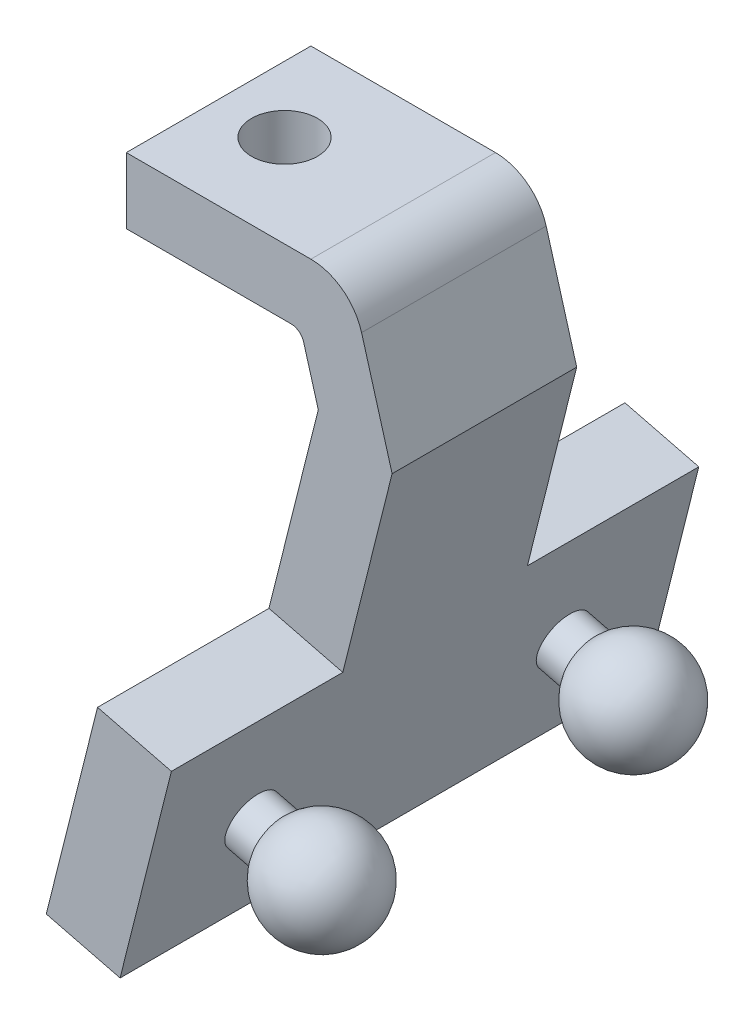
ISO-10303-21;
HEADER;
FILE_DESCRIPTION(('STEP AP214'),'2;1');
FILE_NAME('part.step','',(''),(''),'','','');
FILE_SCHEMA(('AUTOMOTIVE_DESIGN { 1 0 10303 214 1 1 1 1 }'));
ENDSEC;
DATA;
#1=APPLICATION_CONTEXT('core data for automotive mechanical design processes');
#2=APPLICATION_PROTOCOL_DEFINITION('international standard','automotive_design',2000,#1);
#3=PRODUCT_CONTEXT('',#1,'mechanical');
#4=PRODUCT('Part','Part','',(#3));
#5=PRODUCT_RELATED_PRODUCT_CATEGORY('part','',(#4));
#6=PRODUCT_DEFINITION_FORMATION('','',#4);
#7=PRODUCT_DEFINITION_CONTEXT('part definition',#1,'design');
#8=PRODUCT_DEFINITION('design','',#6,#7);
#9=PRODUCT_DEFINITION_SHAPE('','',#8);
#10=(LENGTH_UNIT() NAMED_UNIT(*) SI_UNIT(.MILLI.,.METRE.));
#11=(NAMED_UNIT(*) PLANE_ANGLE_UNIT() SI_UNIT($,.RADIAN.));
#12=(NAMED_UNIT(*) SI_UNIT($,.STERADIAN.) SOLID_ANGLE_UNIT());
#13=UNCERTAINTY_MEASURE_WITH_UNIT(LENGTH_MEASURE(1.E-05),#10,'distance_accuracy_value','');
#14=(GEOMETRIC_REPRESENTATION_CONTEXT(3) GLOBAL_UNCERTAINTY_ASSIGNED_CONTEXT((#13)) GLOBAL_UNIT_ASSIGNED_CONTEXT((#10,
#11,#12)) REPRESENTATION_CONTEXT('',''));
#15=CARTESIAN_POINT('',(0.,0.,0.));
#16=DIRECTION('',(0.,0.,1.));
#17=DIRECTION('',(1.,0.,0.));
#18=AXIS2_PLACEMENT_3D('',#15,#16,#17);
#19=CARTESIAN_POINT('',(0.,0.,3.5));
#20=DIRECTION('',(1.,0.,0.));
#21=DIRECTION('',(0.,0.,-1.));
#22=AXIS2_PLACEMENT_3D('',#19,#20,#21);
#23=PLANE('',#22);
#24=DIRECTION('',(0.,-1.,0.));
#25=VECTOR('',#24,1.);
#26=CARTESIAN_POINT('',(0.,0.,-3.5));
#27=LINE('',#26,#25);
#28=CARTESIAN_POINT('',(0.,2.5,-3.5));
#29=VERTEX_POINT('',#28);
#30=CARTESIAN_POINT('',(0.,0.,-3.5));
#31=VERTEX_POINT('',#30);
#32=EDGE_CURVE('E212',#29,#31,#27,.T.);
#33=ORIENTED_EDGE('',*,*,#32,.T.);
#34=DIRECTION('',(0.,0.,-1.));
#35=VECTOR('',#34,1.);
#36=CARTESIAN_POINT('',(0.,0.,3.5));
#37=LINE('',#36,#35);
#38=CARTESIAN_POINT('',(0.,0.,3.5));
#39=VERTEX_POINT('',#38);
#40=EDGE_CURVE('E252',#39,#31,#37,.T.);
#41=ORIENTED_EDGE('',*,*,#40,.F.);
#42=DIRECTION('',(0.,-1.,0.));
#43=VECTOR('',#42,1.);
#44=CARTESIAN_POINT('',(0.,0.,3.5));
#45=LINE('',#44,#43);
#46=CARTESIAN_POINT('',(0.,2.5,3.5));
#47=VERTEX_POINT('',#46);
#48=EDGE_CURVE('E192',#47,#39,#45,.T.);
#49=ORIENTED_EDGE('',*,*,#48,.F.);
#50=DIRECTION('',(0.,0.,-1.));
#51=VECTOR('',#50,1.);
#52=CARTESIAN_POINT('',(0.,2.5,3.5));
#53=LINE('',#52,#51);
#54=EDGE_CURVE('E211',#47,#29,#53,.T.);
#55=ORIENTED_EDGE('',*,*,#54,.T.);
#56=EDGE_LOOP('',(#33,#41,#49,#55));
#57=FACE_BOUND('',#56,.T.);
#58=ADVANCED_FACE('F41',(#57),#23,.F.);
#59=CARTESIAN_POINT('',(0.,0.,3.5));
#60=DIRECTION('',(0.,1.,0.));
#61=DIRECTION('',(0.,0.,1.));
#62=AXIS2_PLACEMENT_3D('',#59,#60,#61);
#63=PLANE('',#62);
#64=CARTESIAN_POINT('',(2.5,0.,0.));
#65=DIRECTION('',(0.,-1.,0.));
#66=DIRECTION('',(1.,0.,0.));
#67=AXIS2_PLACEMENT_3D('',#64,#65,#66);
#68=CIRCLE('',#67,1.25);
#69=CARTESIAN_POINT('',(3.75,0.,0.));
#70=VERTEX_POINT('',#69);
#71=EDGE_CURVE('E188',#70,#70,#68,.T.);
#72=ORIENTED_EDGE('',*,*,#71,.F.);
#73=EDGE_LOOP('',(#72));
#74=FACE_BOUND('',#73,.T.);
#75=DIRECTION('',(1.,0.,0.));
#76=VECTOR('',#75,1.);
#77=CARTESIAN_POINT('',(0.,0.,-3.5));
#78=LINE('',#77,#76);
#79=CARTESIAN_POINT('',(6.24543275290352,0.,-3.5));
#80=VERTEX_POINT('',#79);
#81=EDGE_CURVE('E215',#31,#80,#78,.T.);
#82=ORIENTED_EDGE('',*,*,#81,.T.);
#83=DIRECTION('',(0.,0.,-1.));
#84=VECTOR('',#83,1.);
#85=CARTESIAN_POINT('',(6.24543275290352,0.,3.5));
#86=LINE('',#85,#84);
#87=CARTESIAN_POINT('',(6.24543275290352,0.,3.5));
#88=VERTEX_POINT('',#87);
#89=EDGE_CURVE('E249',#88,#80,#86,.T.);
#90=ORIENTED_EDGE('',*,*,#89,.F.);
#91=DIRECTION('',(1.,0.,0.));
#92=VECTOR('',#91,1.);
#93=CARTESIAN_POINT('',(0.,0.,3.5));
#94=LINE('',#93,#92);
#95=EDGE_CURVE('E195',#39,#88,#94,.T.);
#96=ORIENTED_EDGE('',*,*,#95,.F.);
#97=ORIENTED_EDGE('',*,*,#40,.T.);
#98=EDGE_LOOP('',(#82,#90,#96,#97));
#99=FACE_BOUND('',#98,.T.);
#100=ADVANCED_FACE('F295',(#74,#99),#63,.F.);
#101=CARTESIAN_POINT('',(6.24543275290367,-0.5,3.5));
#102=DIRECTION('',(0.,0.,-1.));
#103=DIRECTION('',(-1.,0.,0.));
#104=AXIS2_PLACEMENT_3D('',#101,#102,#103);
#105=CYLINDRICAL_SURFACE('',#104,0.499999999999929);
#106=CARTESIAN_POINT('',(6.24543275290367,-0.5,-3.5));
#107=DIRECTION('',(0.,0.,-1.));
#108=DIRECTION('',(-1.,0.,0.));
#109=AXIS2_PLACEMENT_3D('',#106,#107,#108);
#110=CIRCLE('',#109,0.499999999999929);
#111=CARTESIAN_POINT('',(6.72624123981867,-0.362802336352114,-3.5));
#112=VERTEX_POINT('',#111);
#113=EDGE_CURVE('E217',#80,#112,#110,.T.);
#114=ORIENTED_EDGE('',*,*,#113,.T.);
#115=DIRECTION('',(0.,0.,-1.));
#116=VECTOR('',#115,1.);
#117=CARTESIAN_POINT('',(6.72624123981867,-0.362802336352114,3.5));
#118=LINE('',#117,#116);
#119=CARTESIAN_POINT('',(6.72624123981867,-0.362802336352114,3.5));
#120=VERTEX_POINT('',#119);
#121=EDGE_CURVE('E246',#120,#112,#118,.T.);
#122=ORIENTED_EDGE('',*,*,#121,.F.);
#123=CARTESIAN_POINT('',(6.24543275290367,-0.5,3.5));
#124=DIRECTION('',(0.,0.,-1.));
#125=DIRECTION('',(-1.,0.,0.));
#126=AXIS2_PLACEMENT_3D('',#123,#124,#125);
#127=CIRCLE('',#126,0.499999999999929);
#128=EDGE_CURVE('E198',#88,#120,#127,.T.);
#129=ORIENTED_EDGE('',*,*,#128,.F.);
#130=ORIENTED_EDGE('',*,*,#89,.T.);
#131=EDGE_LOOP('',(#114,#122,#129,#130));
#132=FACE_BOUND('',#131,.T.);
#133=ADVANCED_FACE('F291',(#132),#105,.F.);
#134=CARTESIAN_POINT('',(6.7262412398186,-0.362802336352133,3.5));
#135=DIRECTION('',(0.961616973830157,0.274395327295732,0.));
#136=DIRECTION('',(-0.274395327295732,0.961616973830157,0.));
#137=AXIS2_PLACEMENT_3D('',#134,#135,#136);
#138=PLANE('',#137);
#139=DIRECTION('',(0.274395327295732,-0.961616973830156,0.));
#140=VECTOR('',#139,1.);
#141=CARTESIAN_POINT('',(6.7262412398186,-0.362802336352133,-3.5));
#142=LINE('',#141,#140);
#143=CARTESIAN_POINT('',(7.28017081267278,-2.30404559589561,-3.5));
#144=VERTEX_POINT('',#143);
#145=EDGE_CURVE('E219',#112,#144,#142,.T.);
#146=ORIENTED_EDGE('',*,*,#145,.T.);
#147=DIRECTION('',(0.,0.,-1.));
#148=VECTOR('',#147,1.);
#149=CARTESIAN_POINT('',(7.28017081267278,-2.30404559589561,3.5));
#150=LINE('',#149,#148);
#151=CARTESIAN_POINT('',(7.28017081267278,-2.30404559589561,3.5));
#152=VERTEX_POINT('',#151);
#153=EDGE_CURVE('E244',#152,#144,#150,.T.);
#154=ORIENTED_EDGE('',*,*,#153,.F.);
#155=DIRECTION('',(0.274395327295732,-0.961616973830156,0.));
#156=VECTOR('',#155,1.);
#157=CARTESIAN_POINT('',(6.7262412398186,-0.362802336352133,3.5));
#158=LINE('',#157,#156);
#159=EDGE_CURVE('E200',#120,#152,#158,.T.);
#160=ORIENTED_EDGE('',*,*,#159,.F.);
#161=ORIENTED_EDGE('',*,*,#121,.T.);
#162=EDGE_LOOP('',(#146,#154,#160,#161));
#163=FACE_BOUND('',#162,.T.);
#164=ADVANCED_FACE('F286',(#163),#138,.F.);
#165=CARTESIAN_POINT('',(7.28017081267278,-2.30404559589561,3.5));
#166=DIRECTION('',(0.969982391695104,-0.243175162797203,0.));
#167=DIRECTION('',(0.243175162797203,0.969982391695104,0.));
#168=AXIS2_PLACEMENT_3D('',#165,#166,#167);
#169=PLANE('',#168);
#170=DIRECTION('',(-0.243175162797203,-0.969982391695104,0.));
#171=VECTOR('',#170,1.);
#172=CARTESIAN_POINT('',(7.28017081267278,-2.30404559589561,-3.5));
#173=LINE('',#172,#171);
#174=CARTESIAN_POINT('',(5.41022451132622,-9.76292817607996,-3.5));
#175=VERTEX_POINT('',#174);
#176=EDGE_CURVE('E159',#144,#175,#173,.T.);
#177=ORIENTED_EDGE('',*,*,#176,.T.);
#178=DIRECTION('',(0.,0.,1.));
#179=VECTOR('',#178,1.);
#180=CARTESIAN_POINT('',(5.41022451132622,-9.76292817607996,10.));
#181=LINE('',#180,#179);
#182=CARTESIAN_POINT('',(5.41022451132622,-9.76292817607996,-10.));
#183=VERTEX_POINT('',#182);
#184=EDGE_CURVE('E144',#183,#175,#181,.T.);
#185=ORIENTED_EDGE('',*,*,#184,.F.);
#186=DIRECTION('',(0.243175162797199,0.969982391695105,0.));
#187=VECTOR('',#186,1.);
#188=CARTESIAN_POINT('',(5.41022451132622,-9.76292817607996,-10.));
#189=LINE('',#188,#187);
#190=CARTESIAN_POINT('',(3.46482320894863,-17.5227873096408,-10.));
#191=VERTEX_POINT('',#190);
#192=EDGE_CURVE('E156',#191,#183,#189,.T.);
#193=ORIENTED_EDGE('',*,*,#192,.F.);
#194=DIRECTION('',(0.,0.,-1.));
#195=VECTOR('',#194,1.);
#196=CARTESIAN_POINT('',(3.4648232089486,-17.5227873096408,3.5));
#197=LINE('',#196,#195);
#198=CARTESIAN_POINT('',(3.46482320894863,-17.5227873096408,10.));
#199=VERTEX_POINT('',#198);
#200=EDGE_CURVE('E242',#199,#191,#197,.T.);
#201=ORIENTED_EDGE('',*,*,#200,.F.);
#202=DIRECTION('',(-0.243175162797199,-0.969982391695105,0.));
#203=VECTOR('',#202,1.);
#204=CARTESIAN_POINT('',(5.41022451132622,-9.76292817607996,10.));
#205=LINE('',#204,#203);
#206=CARTESIAN_POINT('',(5.41022451132622,-9.76292817607996,10.));
#207=VERTEX_POINT('',#206);
#208=EDGE_CURVE('E150',#207,#199,#205,.T.);
#209=ORIENTED_EDGE('',*,*,#208,.F.);
#210=CARTESIAN_POINT('',(5.41022451132622,-9.76292817607996,3.5));
#211=VERTEX_POINT('',#210);
#212=EDGE_CURVE('E160',#211,#207,#181,.T.);
#213=ORIENTED_EDGE('',*,*,#212,.F.);
#214=DIRECTION('',(-0.243175162797203,-0.969982391695104,0.));
#215=VECTOR('',#214,1.);
#216=CARTESIAN_POINT('',(7.28017081267278,-2.30404559589561,3.5));
#217=LINE('',#216,#215);
#218=EDGE_CURVE('E55',#152,#211,#217,.T.);
#219=ORIENTED_EDGE('',*,*,#218,.F.);
#220=ORIENTED_EDGE('',*,*,#153,.T.);
#221=EDGE_LOOP('',(#177,#185,#193,#201,#209,#213,#219,#220));
#222=FACE_BOUND('',#221,.T.);
#223=ADVANCED_FACE('F155',(#222),#169,.F.);
#224=CARTESIAN_POINT('',(3.4648232089486,-17.5227873096408,3.5));
#225=DIRECTION('',(0.243175162797203,0.969982391695104,0.));
#226=DIRECTION('',(-0.969982391695104,0.243175162797203,0.));
#227=AXIS2_PLACEMENT_3D('',#224,#225,#226);
#228=PLANE('',#227);
#229=ORIENTED_EDGE('',*,*,#200,.T.);
#230=DIRECTION('',(0.969982391695105,-0.243175162797199,0.));
#231=VECTOR('',#230,1.);
#232=CARTESIAN_POINT('',(3.46482320894863,-17.5227873096408,-10.));
#233=LINE('',#232,#231);
#234=CARTESIAN_POINT('',(6.2649211837206,-18.2247735381468,-10.));
#235=VERTEX_POINT('',#234);
#236=EDGE_CURVE('E165',#191,#235,#233,.T.);
#237=ORIENTED_EDGE('',*,*,#236,.T.);
#238=DIRECTION('',(0.,0.,-1.));
#239=VECTOR('',#238,1.);
#240=CARTESIAN_POINT('',(6.26492118372058,-18.2247735381468,3.5));
#241=LINE('',#240,#239);
#242=CARTESIAN_POINT('',(6.2649211837206,-18.2247735381468,10.));
#243=VERTEX_POINT('',#242);
#244=EDGE_CURVE('E240',#243,#235,#241,.T.);
#245=ORIENTED_EDGE('',*,*,#244,.F.);
#246=DIRECTION('',(0.969982391695105,-0.243175162797199,0.));
#247=VECTOR('',#246,1.);
#248=CARTESIAN_POINT('',(3.46482320894863,-17.5227873096408,10.));
#249=LINE('',#248,#247);
#250=EDGE_CURVE('E182',#199,#243,#249,.T.);
#251=ORIENTED_EDGE('',*,*,#250,.F.);
#252=EDGE_LOOP('',(#229,#237,#245,#251));
#253=FACE_BOUND('',#252,.T.);
#254=ADVANCED_FACE('F282',(#253),#228,.F.);
#255=CARTESIAN_POINT('',(6.26492118372058,-18.2247735381468,3.5));
#256=DIRECTION('',(-0.969982391695105,0.243175162797199,0.));
#257=DIRECTION('',(-0.2431751627972,-0.969982391695105,0.));
#258=AXIS2_PLACEMENT_3D('',#255,#256,#257);
#259=PLANE('',#258);
#260=CARTESIAN_POINT('',(7.16843430240252,-14.6208207096341,-5.90579299486001));
#261=DIRECTION('',(-0.969982391695105,0.243175162797199,0.));
#262=DIRECTION('',(0.243175162797199,0.969982391695105,0.));
#263=AXIS2_PLACEMENT_3D('',#260,#261,#262);
#264=CIRCLE('',#263,1.);
#265=CARTESIAN_POINT('',(7.41160946519972,-13.650838317939,-5.90579299486001));
#266=VERTEX_POINT('',#265);
#267=EDGE_CURVE('E341',#266,#266,#264,.T.);
#268=ORIENTED_EDGE('',*,*,#267,.T.);
#269=EDGE_LOOP('',(#268));
#270=FACE_BOUND('',#269,.T.);
#271=CARTESIAN_POINT('',(7.1684343024025,-14.6208207096341,5.90579299486001));
#272=DIRECTION('',(-0.969982391695105,0.243175162797199,0.));
#273=DIRECTION('',(-0.2431751627972,-0.969982391695105,0.));
#274=AXIS2_PLACEMENT_3D('',#271,#272,#273);
#275=CIRCLE('',#274,1.);
#276=CARTESIAN_POINT('',(6.9252591396053,-15.5908031013292,5.90579299486001));
#277=VERTEX_POINT('',#276);
#278=EDGE_CURVE('E11',#277,#277,#275,.F.);
#279=ORIENTED_EDGE('',*,*,#278,.F.);
#280=EDGE_LOOP('',(#279));
#281=FACE_BOUND('',#280,.T.);
#282=DIRECTION('',(0.243175162797199,0.969982391695105,0.));
#283=VECTOR('',#282,1.);
#284=CARTESIAN_POINT('',(6.26492118372058,-18.2247735381468,3.5));
#285=LINE('',#284,#283);
#286=CARTESIAN_POINT('',(8.21032248609819,-10.464914404586,3.5));
#287=VERTEX_POINT('',#286);
#288=CARTESIAN_POINT('',(10.0802687874447,-3.00603182440153,3.5));
#289=VERTEX_POINT('',#288);
#290=EDGE_CURVE('E203',#287,#289,#285,.T.);
#291=ORIENTED_EDGE('',*,*,#290,.F.);
#292=DIRECTION('',(0.,0.,1.));
#293=VECTOR('',#292,1.);
#294=CARTESIAN_POINT('',(8.21032248609819,-10.464914404586,10.));
#295=LINE('',#294,#293);
#296=CARTESIAN_POINT('',(8.21032248609819,-10.464914404586,10.));
#297=VERTEX_POINT('',#296);
#298=EDGE_CURVE('E178',#287,#297,#295,.T.);
#299=ORIENTED_EDGE('',*,*,#298,.T.);
#300=DIRECTION('',(-0.243175162797199,-0.969982391695105,0.));
#301=VECTOR('',#300,1.);
#302=CARTESIAN_POINT('',(8.21032248609819,-10.464914404586,10.));
#303=LINE('',#302,#301);
#304=EDGE_CURVE('E166',#297,#243,#303,.T.);
#305=ORIENTED_EDGE('',*,*,#304,.T.);
#306=ORIENTED_EDGE('',*,*,#244,.T.);
#307=DIRECTION('',(0.243175162797199,0.969982391695105,0.));
#308=VECTOR('',#307,1.);
#309=CARTESIAN_POINT('',(8.21032248609819,-10.464914404586,-10.));
#310=LINE('',#309,#308);
#311=CARTESIAN_POINT('',(8.21032248609819,-10.464914404586,-10.));
#312=VERTEX_POINT('',#311);
#313=EDGE_CURVE('E176',#235,#312,#310,.T.);
#314=ORIENTED_EDGE('',*,*,#313,.T.);
#315=CARTESIAN_POINT('',(8.21032248609817,-10.464914404586,-3.5));
#316=VERTEX_POINT('',#315);
#317=EDGE_CURVE('E63',#312,#316,#295,.T.);
#318=ORIENTED_EDGE('',*,*,#317,.T.);
#319=DIRECTION('',(0.243175162797199,0.969982391695105,0.));
#320=VECTOR('',#319,1.);
#321=CARTESIAN_POINT('',(6.26492118372058,-18.2247735381468,-3.5));
#322=LINE('',#321,#320);
#323=CARTESIAN_POINT('',(10.0802687874447,-3.00603182440153,-3.5));
#324=VERTEX_POINT('',#323);
#325=EDGE_CURVE('E222',#316,#324,#322,.T.);
#326=ORIENTED_EDGE('',*,*,#325,.T.);
#327=DIRECTION('',(0.,0.,-1.));
#328=VECTOR('',#327,1.);
#329=CARTESIAN_POINT('',(10.0802687874447,-3.00603182440153,3.5));
#330=LINE('',#329,#328);
#331=EDGE_CURVE('E237',#289,#324,#330,.T.);
#332=ORIENTED_EDGE('',*,*,#331,.F.);
#333=EDGE_LOOP('',(#291,#299,#305,#306,#314,#318,#326,#332));
#334=FACE_BOUND('',#333,.T.);
#335=ADVANCED_FACE('F263',(#270,#281,#334),#259,.F.);
#336=CARTESIAN_POINT('',(10.0802687874447,-3.00603182440153,3.5));
#337=DIRECTION('',(-0.961616973830156,-0.274395327295733,0.));
#338=DIRECTION('',(0.274395327295733,-0.961616973830156,0.));
#339=AXIS2_PLACEMENT_3D('',#336,#337,#338);
#340=PLANE('',#339);
#341=DIRECTION('',(-0.274395327295733,0.961616973830157,0.));
#342=VECTOR('',#341,1.);
#343=CARTESIAN_POINT('',(10.0802687874447,-3.00603182440153,-3.5));
#344=LINE('',#343,#342);
#345=CARTESIAN_POINT('',(8.92323394766049,1.04879065459145,-3.5));
#346=VERTEX_POINT('',#345);
#347=EDGE_CURVE('E224',#324,#346,#344,.T.);
#348=ORIENTED_EDGE('',*,*,#347,.T.);
#349=DIRECTION('',(0.,0.,-1.));
#350=VECTOR('',#349,1.);
#351=CARTESIAN_POINT('',(8.92323394766049,1.04879065459145,3.5));
#352=LINE('',#351,#350);
#353=CARTESIAN_POINT('',(8.92323394766049,1.04879065459145,3.5));
#354=VERTEX_POINT('',#353);
#355=EDGE_CURVE('E234',#354,#346,#352,.T.);
#356=ORIENTED_EDGE('',*,*,#355,.F.);
#357=DIRECTION('',(-0.274395327295733,0.961616973830157,0.));
#358=VECTOR('',#357,1.);
#359=CARTESIAN_POINT('',(10.0802687874447,-3.00603182440153,3.5));
#360=LINE('',#359,#358);
#361=EDGE_CURVE('E205',#289,#354,#360,.T.);
#362=ORIENTED_EDGE('',*,*,#361,.F.);
#363=ORIENTED_EDGE('',*,*,#331,.T.);
#364=EDGE_LOOP('',(#348,#356,#362,#363));
#365=FACE_BOUND('',#364,.T.);
#366=ADVANCED_FACE('F266',(#365),#340,.F.);
#367=CARTESIAN_POINT('',(7.,0.5,3.5));
#368=DIRECTION('',(0.,0.,-1.));
#369=DIRECTION('',(-1.,0.,0.));
#370=AXIS2_PLACEMENT_3D('',#367,#368,#369);
#371=CYLINDRICAL_SURFACE('',#370,2.00000000000008);
#372=CARTESIAN_POINT('',(7.,0.5,-3.5));
#373=DIRECTION('',(0.,0.,1.));
#374=DIRECTION('',(1.,0.,0.));
#375=AXIS2_PLACEMENT_3D('',#372,#373,#374);
#376=CIRCLE('',#375,2.00000000000008);
#377=CARTESIAN_POINT('',(7.,2.50000000000008,-3.5));
#378=VERTEX_POINT('',#377);
#379=EDGE_CURVE('E226',#346,#378,#376,.T.);
#380=ORIENTED_EDGE('',*,*,#379,.T.);
#381=DIRECTION('',(0.,0.,-1.));
#382=VECTOR('',#381,1.);
#383=CARTESIAN_POINT('',(7.,2.50000000000008,3.5));
#384=LINE('',#383,#382);
#385=CARTESIAN_POINT('',(7.,2.50000000000008,3.5));
#386=VERTEX_POINT('',#385);
#387=EDGE_CURVE('E231',#386,#378,#384,.T.);
#388=ORIENTED_EDGE('',*,*,#387,.F.);
#389=CARTESIAN_POINT('',(7.,0.5,3.5));
#390=DIRECTION('',(0.,0.,1.));
#391=DIRECTION('',(1.,0.,0.));
#392=AXIS2_PLACEMENT_3D('',#389,#390,#391);
#393=CIRCLE('',#392,2.00000000000008);
#394=EDGE_CURVE('E207',#354,#386,#393,.T.);
#395=ORIENTED_EDGE('',*,*,#394,.F.);
#396=ORIENTED_EDGE('',*,*,#355,.T.);
#397=EDGE_LOOP('',(#380,#388,#395,#396));
#398=FACE_BOUND('',#397,.T.);
#399=ADVANCED_FACE('F305',(#398),#371,.T.);
#400=CARTESIAN_POINT('',(0.,2.5,3.5));
#401=DIRECTION('',(0.,-1.,0.));
#402=DIRECTION('',(0.,0.,-1.));
#403=AXIS2_PLACEMENT_3D('',#400,#401,#402);
#404=PLANE('',#403);
#405=CARTESIAN_POINT('',(2.5,2.5,0.));
#406=DIRECTION('',(0.,-1.,0.));
#407=DIRECTION('',(0.,0.,-1.));
#408=AXIS2_PLACEMENT_3D('',#405,#406,#407);
#409=CIRCLE('',#408,1.25);
#410=CARTESIAN_POINT('',(2.5,2.5,-1.25));
#411=VERTEX_POINT('',#410);
#412=EDGE_CURVE('E191',#411,#411,#409,.T.);
#413=ORIENTED_EDGE('',*,*,#412,.T.);
#414=EDGE_LOOP('',(#413));
#415=FACE_BOUND('',#414,.T.);
#416=DIRECTION('',(-1.,0.,0.));
#417=VECTOR('',#416,1.);
#418=CARTESIAN_POINT('',(0.,2.5,-3.5));
#419=LINE('',#418,#417);
#420=EDGE_CURVE('E196',#378,#29,#419,.T.);
#421=ORIENTED_EDGE('',*,*,#420,.T.);
#422=ORIENTED_EDGE('',*,*,#54,.F.);
#423=DIRECTION('',(-1.,0.,0.));
#424=VECTOR('',#423,1.);
#425=CARTESIAN_POINT('',(0.,2.5,3.5));
#426=LINE('',#425,#424);
#427=EDGE_CURVE('E209',#386,#47,#426,.T.);
#428=ORIENTED_EDGE('',*,*,#427,.F.);
#429=ORIENTED_EDGE('',*,*,#387,.T.);
#430=EDGE_LOOP('',(#421,#422,#428,#429));
#431=FACE_BOUND('',#430,.T.);
#432=ADVANCED_FACE('F302',(#415,#431),#404,.F.);
#433=CARTESIAN_POINT('',(7.,0.5,3.5));
#434=DIRECTION('',(0.,0.,1.));
#435=DIRECTION('',(1.,0.,0.));
#436=AXIS2_PLACEMENT_3D('',#433,#434,#435);
#437=PLANE('',#436);
#438=DIRECTION('',(-0.969982391695105,0.243175162797199,0.));
#439=VECTOR('',#438,1.);
#440=CARTESIAN_POINT('',(4.48521535396686,-9.53102782989257,3.5));
#441=LINE('',#440,#439);
#442=EDGE_CURVE('E181',#287,#211,#441,.T.);
#443=ORIENTED_EDGE('',*,*,#442,.F.);
#444=ORIENTED_EDGE('',*,*,#290,.T.);
#445=ORIENTED_EDGE('',*,*,#361,.T.);
#446=ORIENTED_EDGE('',*,*,#394,.T.);
#447=ORIENTED_EDGE('',*,*,#427,.T.);
#448=ORIENTED_EDGE('',*,*,#48,.T.);
#449=ORIENTED_EDGE('',*,*,#95,.T.);
#450=ORIENTED_EDGE('',*,*,#128,.T.);
#451=ORIENTED_EDGE('',*,*,#159,.T.);
#452=ORIENTED_EDGE('',*,*,#218,.T.);
#453=EDGE_LOOP('',(#443,#444,#445,#446,#447,#448,#449,#450,#451,#452));
#454=FACE_BOUND('',#453,.T.);
#455=ADVANCED_FACE('F269',(#454),#437,.T.);
#456=CARTESIAN_POINT('',(7.,0.5,-3.5));
#457=DIRECTION('',(0.,0.,1.));
#458=DIRECTION('',(1.,0.,0.));
#459=AXIS2_PLACEMENT_3D('',#456,#457,#458);
#460=PLANE('',#459);
#461=ORIENTED_EDGE('',*,*,#325,.F.);
#462=DIRECTION('',(-0.969982391695105,0.243175162797199,0.));
#463=VECTOR('',#462,1.);
#464=CARTESIAN_POINT('',(4.48521535396686,-9.53102782989257,-3.5));
#465=LINE('',#464,#463);
#466=EDGE_CURVE('E48',#316,#175,#465,.T.);
#467=ORIENTED_EDGE('',*,*,#466,.T.);
#468=ORIENTED_EDGE('',*,*,#176,.F.);
#469=ORIENTED_EDGE('',*,*,#145,.F.);
#470=ORIENTED_EDGE('',*,*,#113,.F.);
#471=ORIENTED_EDGE('',*,*,#81,.F.);
#472=ORIENTED_EDGE('',*,*,#32,.F.);
#473=ORIENTED_EDGE('',*,*,#420,.F.);
#474=ORIENTED_EDGE('',*,*,#379,.F.);
#475=ORIENTED_EDGE('',*,*,#347,.F.);
#476=EDGE_LOOP('',(#461,#467,#468,#469,#470,#471,#472,#473,#474,#475));
#477=FACE_BOUND('',#476,.T.);
#478=ADVANCED_FACE('F258',(#477),#460,.F.);
#479=CARTESIAN_POINT('',(2.5,5.5,0.));
#480=DIRECTION('',(0.,-1.,0.));
#481=DIRECTION('',(1.,0.,0.));
#482=AXIS2_PLACEMENT_3D('',#479,#480,#481);
#483=CYLINDRICAL_SURFACE('',#482,1.25);
#484=ORIENTED_EDGE('',*,*,#71,.T.);
#485=EDGE_LOOP('',(#484));
#486=FACE_BOUND('',#485,.T.);
#487=ORIENTED_EDGE('',*,*,#412,.F.);
#488=EDGE_LOOP('',(#487));
#489=FACE_BOUND('',#488,.T.);
#490=ADVANCED_FACE('F363',(#486,#489),#483,.F.);
#491=CARTESIAN_POINT('',(5.41022451132622,-9.76292817607996,-10.));
#492=DIRECTION('',(0.,0.,-1.));
#493=DIRECTION('',(-1.,0.,0.));
#494=AXIS2_PLACEMENT_3D('',#491,#492,#493);
#495=PLANE('',#494);
#496=ORIENTED_EDGE('',*,*,#313,.F.);
#497=ORIENTED_EDGE('',*,*,#236,.F.);
#498=ORIENTED_EDGE('',*,*,#192,.T.);
#499=DIRECTION('',(0.969982391695105,-0.243175162797199,0.));
#500=VECTOR('',#499,1.);
#501=CARTESIAN_POINT('',(5.41022451132622,-9.76292817607996,-10.));
#502=LINE('',#501,#500);
#503=EDGE_CURVE('E141',#183,#312,#502,.T.);
#504=ORIENTED_EDGE('',*,*,#503,.T.);
#505=EDGE_LOOP('',(#496,#497,#498,#504));
#506=FACE_BOUND('',#505,.T.);
#507=ADVANCED_FACE('F163',(#506),#495,.T.);
#508=CARTESIAN_POINT('',(5.41022451132622,-9.76292817607996,10.));
#509=DIRECTION('',(0.243175162797199,0.969982391695105,0.));
#510=DIRECTION('',(-0.969982391695105,0.243175162797199,0.));
#511=AXIS2_PLACEMENT_3D('',#508,#509,#510);
#512=PLANE('',#511);
#513=ORIENTED_EDGE('',*,*,#466,.F.);
#514=ORIENTED_EDGE('',*,*,#317,.F.);
#515=ORIENTED_EDGE('',*,*,#503,.F.);
#516=ORIENTED_EDGE('',*,*,#184,.T.);
#517=EDGE_LOOP('',(#513,#514,#515,#516));
#518=FACE_BOUND('',#517,.T.);
#519=ADVANCED_FACE('F143',(#518),#512,.T.);
#520=CARTESIAN_POINT('',(5.41022451132622,-9.76292817607996,10.));
#521=DIRECTION('',(0.,0.,1.));
#522=DIRECTION('',(0.,-1.,0.));
#523=AXIS2_PLACEMENT_3D('',#520,#521,#522);
#524=PLANE('',#523);
#525=ORIENTED_EDGE('',*,*,#304,.F.);
#526=DIRECTION('',(0.969982391695105,-0.243175162797199,0.));
#527=VECTOR('',#526,1.);
#528=CARTESIAN_POINT('',(5.41022451132622,-9.76292817607996,10.));
#529=LINE('',#528,#527);
#530=EDGE_CURVE('E149',#207,#297,#529,.T.);
#531=ORIENTED_EDGE('',*,*,#530,.F.);
#532=ORIENTED_EDGE('',*,*,#208,.T.);
#533=ORIENTED_EDGE('',*,*,#250,.T.);
#534=EDGE_LOOP('',(#525,#531,#532,#533));
#535=FACE_BOUND('',#534,.T.);
#536=ADVANCED_FACE('F279',(#535),#524,.T.);
#537=ORIENTED_EDGE('',*,*,#298,.F.);
#538=ORIENTED_EDGE('',*,*,#442,.T.);
#539=ORIENTED_EDGE('',*,*,#212,.T.);
#540=ORIENTED_EDGE('',*,*,#530,.T.);
#541=EDGE_LOOP('',(#537,#538,#539,#540));
#542=FACE_BOUND('',#541,.T.);
#543=ADVANCED_FACE('F275',(#542),#512,.T.);
#544=CARTESIAN_POINT('',(8.13841669409762,-14.8639958724313,5.90579299486001));
#545=DIRECTION('',(-0.969982391695105,0.243175162797199,0.));
#546=DIRECTION('',(-0.243175162797199,-0.969982391695105,0.));
#547=AXIS2_PLACEMENT_3D('',#544,#545,#546);
#548=CYLINDRICAL_SURFACE('',#547,1.);
#549=CARTESIAN_POINT('',(8.13841669409762,-14.8639958724313,5.90579299486001));
#550=DIRECTION('',(0.969982391695105,-0.243175162797199,0.));
#551=DIRECTION('',(0.243175162797199,0.969982391695105,0.));
#552=AXIS2_PLACEMENT_3D('',#549,#550,#551);
#553=CIRCLE('',#552,1.);
#554=CARTESIAN_POINT('',(8.38159185689482,-13.8940134807362,5.90579299486001));
#555=VERTEX_POINT('',#554);
#556=EDGE_CURVE('E171',#555,#555,#553,.T.);
#557=ORIENTED_EDGE('',*,*,#556,.F.);
#558=EDGE_LOOP('',(#557));
#559=FACE_BOUND('',#558,.T.);
#560=ORIENTED_EDGE('',*,*,#278,.T.);
#561=EDGE_LOOP('',(#560));
#562=FACE_BOUND('',#561,.T.);
#563=ADVANCED_FACE('F344',(#559,#562),#548,.T.);
#564=CARTESIAN_POINT('',(9.81847547896072,-15.2851876095349,5.90579299486001));
#565=DIRECTION('',(-0.969982391695105,0.243175162797199,0.));
#566=DIRECTION('',(0.,0.,1.));
#567=AXIS2_PLACEMENT_3D('',#564,#565,#566);
#568=SPHERICAL_SURFACE('',#567,2.);
#569=ORIENTED_EDGE('',*,*,#556,.T.);
#570=EDGE_LOOP('',(#569));
#571=FACE_BOUND('',#570,.T.);
#572=ADVANCED_FACE('F346',(#571),#568,.T.);
#573=CARTESIAN_POINT('',(8.13841669409762,-14.8639958724313,-5.90579299486001));
#574=DIRECTION('',(-0.969982391695105,0.243175162797199,0.));
#575=DIRECTION('',(-0.243175162797199,-0.969982391695105,0.));
#576=AXIS2_PLACEMENT_3D('',#573,#574,#575);
#577=CYLINDRICAL_SURFACE('',#576,1.);
#578=CARTESIAN_POINT('',(8.13841669409763,-14.8639958724313,-5.90579299486001));
#579=DIRECTION('',(0.969982391695105,-0.243175162797199,0.));
#580=DIRECTION('',(-0.243175162797199,-0.969982391695105,0.));
#581=AXIS2_PLACEMENT_3D('',#578,#579,#580);
#582=CIRCLE('',#581,1.);
#583=CARTESIAN_POINT('',(7.89524153130043,-15.8339782641264,-5.90579299486001));
#584=VERTEX_POINT('',#583);
#585=EDGE_CURVE('E429',#584,#584,#582,.T.);
#586=ORIENTED_EDGE('',*,*,#585,.F.);
#587=EDGE_LOOP('',(#586));
#588=FACE_BOUND('',#587,.T.);
#589=ORIENTED_EDGE('',*,*,#267,.F.);
#590=EDGE_LOOP('',(#589));
#591=FACE_BOUND('',#590,.T.);
#592=ADVANCED_FACE('F352',(#588,#591),#577,.T.);
#593=CARTESIAN_POINT('',(9.81847547896072,-15.2851876095349,-5.90579299486001));
#594=DIRECTION('',(-0.969982391695105,0.243175162797199,0.));
#595=DIRECTION('',(0.,0.,-1.));
#596=AXIS2_PLACEMENT_3D('',#593,#594,#595);
#597=SPHERICAL_SURFACE('',#596,2.);
#598=ORIENTED_EDGE('',*,*,#585,.T.);
#599=EDGE_LOOP('',(#598));
#600=FACE_BOUND('',#599,.T.);
#601=ADVANCED_FACE('F415',(#600),#597,.T.);
#602=CLOSED_SHELL('',(#58,#100,#133,#164,#223,#254,#335,#366,#399,#432,#455,#478,#490,#507,#519,
#536,#543,#563,#572,#592,#601));
#603=MANIFOLD_SOLID_BREP('B2',#602);
#604=ADVANCED_BREP_SHAPE_REPRESENTATION('',(#18,#603),#14);
#605=SHAPE_DEFINITION_REPRESENTATION(#9,#604);
ENDSEC;
END-ISO-10303-21;
